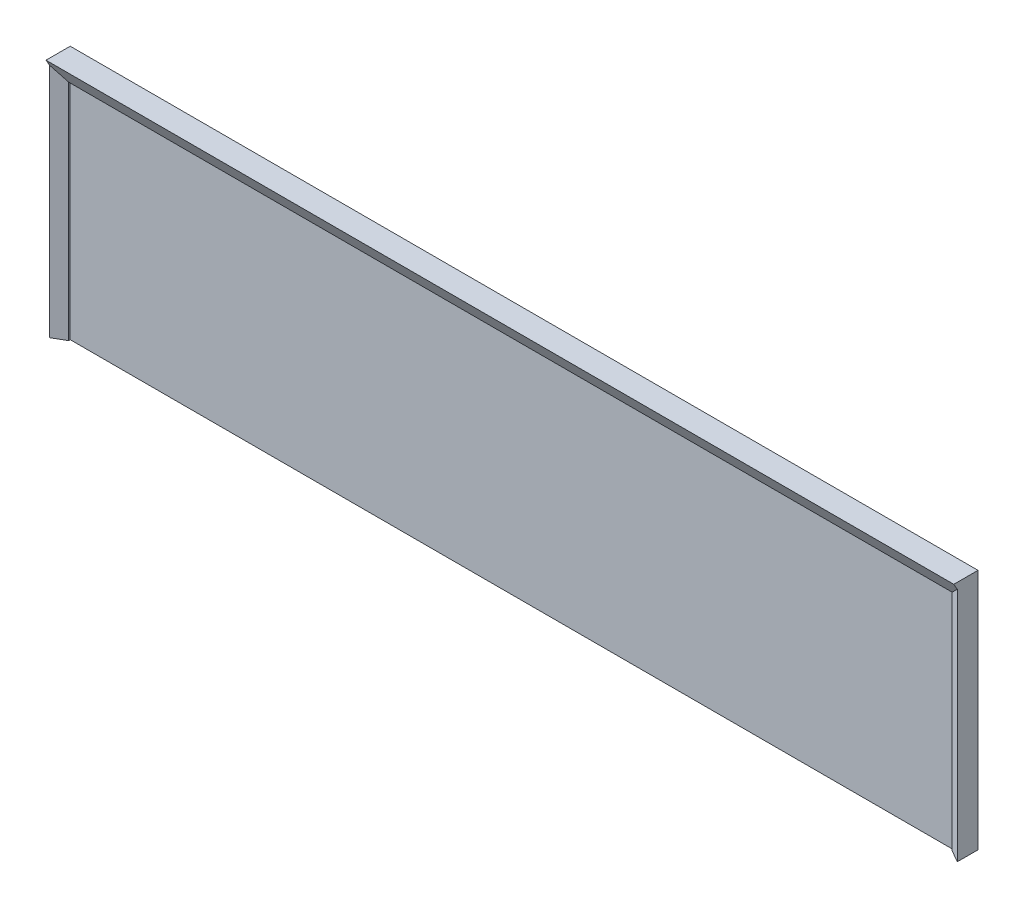
ISO-10303-21;
HEADER;
FILE_DESCRIPTION(('STEP AP214'),'2;1');
FILE_NAME('part.step','',(''),(''),'','','');
FILE_SCHEMA(('AUTOMOTIVE_DESIGN { 1 0 10303 214 1 1 1 1 }'));
ENDSEC;
DATA;
#1=APPLICATION_CONTEXT('core data for automotive mechanical design processes');
#2=APPLICATION_PROTOCOL_DEFINITION('international standard','automotive_design',2000,#1);
#3=PRODUCT_CONTEXT('',#1,'mechanical');
#4=PRODUCT('Part','Part','',(#3));
#5=PRODUCT_RELATED_PRODUCT_CATEGORY('part','',(#4));
#6=PRODUCT_DEFINITION_FORMATION('','',#4);
#7=PRODUCT_DEFINITION_CONTEXT('part definition',#1,'design');
#8=PRODUCT_DEFINITION('design','',#6,#7);
#9=PRODUCT_DEFINITION_SHAPE('','',#8);
#10=(LENGTH_UNIT() NAMED_UNIT(*) SI_UNIT(.MILLI.,.METRE.));
#11=(NAMED_UNIT(*) PLANE_ANGLE_UNIT() SI_UNIT($,.RADIAN.));
#12=(NAMED_UNIT(*) SI_UNIT($,.STERADIAN.) SOLID_ANGLE_UNIT());
#13=UNCERTAINTY_MEASURE_WITH_UNIT(LENGTH_MEASURE(1.E-05),#10,'distance_accuracy_value','');
#14=(GEOMETRIC_REPRESENTATION_CONTEXT(3) GLOBAL_UNCERTAINTY_ASSIGNED_CONTEXT((#13)) GLOBAL_UNIT_ASSIGNED_CONTEXT((#10,
#11,#12)) REPRESENTATION_CONTEXT('',''));
#15=CARTESIAN_POINT('',(0.,0.,0.));
#16=DIRECTION('',(0.,0.,1.));
#17=DIRECTION('',(1.,0.,0.));
#18=AXIS2_PLACEMENT_3D('',#15,#16,#17);
#19=CARTESIAN_POINT('',(0.,0.,2.));
#20=DIRECTION('',(0.,1.,0.));
#21=DIRECTION('',(0.,0.,1.));
#22=AXIS2_PLACEMENT_3D('',#19,#20,#21);
#23=PLANE('',#22);
#24=DIRECTION('',(0.,0.,-1.));
#25=VECTOR('',#24,1.);
#26=CARTESIAN_POINT('',(150.,0.,4.));
#27=LINE('',#26,#25);
#28=CARTESIAN_POINT('',(150.,0.,3.42264973081036));
#29=VERTEX_POINT('',#28);
#30=CARTESIAN_POINT('',(150.,0.,0.));
#31=VERTEX_POINT('',#30);
#32=EDGE_CURVE('E124',#29,#31,#27,.T.);
#33=ORIENTED_EDGE('',*,*,#32,.F.);
#34=DIRECTION('',(-0.86602540378444,0.,-0.499999999999998));
#35=VECTOR('',#34,1.);
#36=CARTESIAN_POINT('',(151.,0.,4.));
#37=LINE('',#36,#35);
#38=CARTESIAN_POINT('',(148.,0.,2.26794919243111));
#39=VERTEX_POINT('',#38);
#40=EDGE_CURVE('E152',#29,#39,#37,.T.);
#41=ORIENTED_EDGE('',*,*,#40,.T.);
#42=DIRECTION('',(0.,0.,-1.));
#43=VECTOR('',#42,1.);
#44=CARTESIAN_POINT('',(148.,0.,4.));
#45=LINE('',#44,#43);
#46=CARTESIAN_POINT('',(148.,0.,2.));
#47=VERTEX_POINT('',#46);
#48=EDGE_CURVE('E174',#39,#47,#45,.T.);
#49=ORIENTED_EDGE('',*,*,#48,.T.);
#50=DIRECTION('',(1.,0.,0.));
#51=VECTOR('',#50,1.);
#52=CARTESIAN_POINT('',(0.,0.,2.));
#53=LINE('',#52,#51);
#54=CARTESIAN_POINT('',(2.,0.,2.));
#55=VERTEX_POINT('',#54);
#56=EDGE_CURVE('E146',#55,#47,#53,.T.);
#57=ORIENTED_EDGE('',*,*,#56,.F.);
#58=DIRECTION('',(0.,0.,-1.));
#59=VECTOR('',#58,1.);
#60=CARTESIAN_POINT('',(2.,0.,4.));
#61=LINE('',#60,#59);
#62=CARTESIAN_POINT('',(2.,0.,2.26794919243111));
#63=VERTEX_POINT('',#62);
#64=EDGE_CURVE('E133',#63,#55,#61,.T.);
#65=ORIENTED_EDGE('',*,*,#64,.F.);
#66=DIRECTION('',(0.86602540378444,0.,-0.499999999999998));
#67=VECTOR('',#66,1.);
#68=CARTESIAN_POINT('',(2.,0.,2.26794919243111));
#69=LINE('',#68,#67);
#70=CARTESIAN_POINT('',(0.,0.,3.42264973081036));
#71=VERTEX_POINT('',#70);
#72=EDGE_CURVE('E143',#63,#71,#69,.F.);
#73=ORIENTED_EDGE('',*,*,#72,.T.);
#74=DIRECTION('',(0.,0.,-1.));
#75=VECTOR('',#74,1.);
#76=CARTESIAN_POINT('',(0.,0.,4.));
#77=LINE('',#76,#75);
#78=CARTESIAN_POINT('',(0.,0.,0.));
#79=VERTEX_POINT('',#78);
#80=EDGE_CURVE('E170',#71,#79,#77,.T.);
#81=ORIENTED_EDGE('',*,*,#80,.T.);
#82=DIRECTION('',(1.,0.,0.));
#83=VECTOR('',#82,1.);
#84=CARTESIAN_POINT('',(0.,0.,0.));
#85=LINE('',#84,#83);
#86=EDGE_CURVE('E149',#79,#31,#85,.T.);
#87=ORIENTED_EDGE('',*,*,#86,.T.);
#88=EDGE_LOOP('',(#33,#41,#49,#57,#65,#73,#81,#87));
#89=FACE_BOUND('',#88,.T.);
#90=ADVANCED_FACE('F41',(#89),#23,.F.);
#91=CARTESIAN_POINT('',(0.,0.,2.));
#92=DIRECTION('',(0.,0.,1.));
#93=DIRECTION('',(1.,0.,0.));
#94=AXIS2_PLACEMENT_3D('',#91,#92,#93);
#95=PLANE('',#94);
#96=DIRECTION('',(1.,0.,0.));
#97=VECTOR('',#96,1.);
#98=CARTESIAN_POINT('',(0.,37.,2.));
#99=LINE('',#98,#97);
#100=CARTESIAN_POINT('',(2.,37.,2.));
#101=VERTEX_POINT('',#100);
#102=CARTESIAN_POINT('',(148.,37.,2.));
#103=VERTEX_POINT('',#102);
#104=EDGE_CURVE('E180',#101,#103,#99,.T.);
#105=ORIENTED_EDGE('',*,*,#104,.F.);
#106=DIRECTION('',(0.,-1.,0.));
#107=VECTOR('',#106,1.);
#108=CARTESIAN_POINT('',(2.,0.,2.));
#109=LINE('',#108,#107);
#110=EDGE_CURVE('E183',#101,#55,#109,.T.);
#111=ORIENTED_EDGE('',*,*,#110,.T.);
#112=ORIENTED_EDGE('',*,*,#56,.T.);
#113=DIRECTION('',(0.,-1.,0.));
#114=VECTOR('',#113,1.);
#115=CARTESIAN_POINT('',(148.,0.,2.));
#116=LINE('',#115,#114);
#117=EDGE_CURVE('E141',#103,#47,#116,.T.);
#118=ORIENTED_EDGE('',*,*,#117,.F.);
#119=EDGE_LOOP('',(#105,#111,#112,#118));
#120=FACE_BOUND('',#119,.T.);
#121=ADVANCED_FACE('F191',(#120),#95,.T.);
#122=CARTESIAN_POINT('',(0.,0.,0.));
#123=DIRECTION('',(0.,0.,1.));
#124=DIRECTION('',(1.,0.,0.));
#125=AXIS2_PLACEMENT_3D('',#122,#123,#124);
#126=PLANE('',#125);
#127=ORIENTED_EDGE('',*,*,#86,.F.);
#128=DIRECTION('',(0.,1.,0.));
#129=VECTOR('',#128,1.);
#130=CARTESIAN_POINT('',(0.,0.,0.));
#131=LINE('',#130,#129);
#132=CARTESIAN_POINT('',(0.,40.,0.));
#133=VERTEX_POINT('',#132);
#134=EDGE_CURVE('E134',#79,#133,#131,.T.);
#135=ORIENTED_EDGE('',*,*,#134,.T.);
#136=DIRECTION('',(1.,0.,0.));
#137=VECTOR('',#136,1.);
#138=CARTESIAN_POINT('',(0.,40.,0.));
#139=LINE('',#138,#137);
#140=CARTESIAN_POINT('',(150.,40.,0.));
#141=VERTEX_POINT('',#140);
#142=EDGE_CURVE('E163',#133,#141,#139,.T.);
#143=ORIENTED_EDGE('',*,*,#142,.T.);
#144=DIRECTION('',(0.,1.,0.));
#145=VECTOR('',#144,1.);
#146=CARTESIAN_POINT('',(150.,0.,0.));
#147=LINE('',#146,#145);
#148=EDGE_CURVE('E120',#31,#141,#147,.T.);
#149=ORIENTED_EDGE('',*,*,#148,.F.);
#150=EDGE_LOOP('',(#127,#135,#143,#149));
#151=FACE_BOUND('',#150,.T.);
#152=ADVANCED_FACE('F211',(#151),#126,.F.);
#153=CARTESIAN_POINT('',(2.,0.,4.));
#154=DIRECTION('',(1.,0.,0.));
#155=DIRECTION('',(0.,1.,0.));
#156=AXIS2_PLACEMENT_3D('',#153,#154,#155);
#157=PLANE('',#156);
#158=DIRECTION('',(0.,0.,-1.));
#159=VECTOR('',#158,1.);
#160=CARTESIAN_POINT('',(2.,37.,4.));
#161=LINE('',#160,#159);
#162=CARTESIAN_POINT('',(2.,37.,2.26794919243111));
#163=VERTEX_POINT('',#162);
#164=EDGE_CURVE('E178',#163,#101,#161,.T.);
#165=ORIENTED_EDGE('',*,*,#164,.F.);
#166=DIRECTION('',(0.,-1.,0.));
#167=VECTOR('',#166,1.);
#168=CARTESIAN_POINT('',(2.,0.,2.26794919243111));
#169=LINE('',#168,#167);
#170=EDGE_CURVE('E157',#163,#63,#169,.T.);
#171=ORIENTED_EDGE('',*,*,#170,.T.);
#172=ORIENTED_EDGE('',*,*,#64,.T.);
#173=ORIENTED_EDGE('',*,*,#110,.F.);
#174=EDGE_LOOP('',(#165,#171,#172,#173));
#175=FACE_BOUND('',#174,.T.);
#176=ADVANCED_FACE('F204',(#175),#157,.T.);
#177=CARTESIAN_POINT('',(0.,37.,4.));
#178=DIRECTION('',(0.,1.,0.));
#179=DIRECTION('',(0.,0.,1.));
#180=AXIS2_PLACEMENT_3D('',#177,#178,#179);
#181=PLANE('',#180);
#182=DIRECTION('',(0.,0.,-1.));
#183=VECTOR('',#182,1.);
#184=CARTESIAN_POINT('',(148.,37.,4.));
#185=LINE('',#184,#183);
#186=CARTESIAN_POINT('',(148.,37.,2.26794919243111));
#187=VERTEX_POINT('',#186);
#188=EDGE_CURVE('E176',#187,#103,#185,.T.);
#189=ORIENTED_EDGE('',*,*,#188,.F.);
#190=DIRECTION('',(-1.,0.,0.));
#191=VECTOR('',#190,1.);
#192=CARTESIAN_POINT('',(2.,37.,2.26794919243111));
#193=LINE('',#192,#191);
#194=EDGE_CURVE('E11',#187,#163,#193,.T.);
#195=ORIENTED_EDGE('',*,*,#194,.T.);
#196=ORIENTED_EDGE('',*,*,#164,.T.);
#197=ORIENTED_EDGE('',*,*,#104,.T.);
#198=EDGE_LOOP('',(#189,#195,#196,#197));
#199=FACE_BOUND('',#198,.T.);
#200=ADVANCED_FACE('F201',(#199),#181,.F.);
#201=CARTESIAN_POINT('',(148.,0.,4.));
#202=DIRECTION('',(1.,0.,0.));
#203=DIRECTION('',(0.,0.,-1.));
#204=AXIS2_PLACEMENT_3D('',#201,#202,#203);
#205=PLANE('',#204);
#206=ORIENTED_EDGE('',*,*,#48,.F.);
#207=DIRECTION('',(0.,1.,0.));
#208=VECTOR('',#207,1.);
#209=CARTESIAN_POINT('',(148.,37.,2.26794919243111));
#210=LINE('',#209,#208);
#211=EDGE_CURVE('E154',#39,#187,#210,.T.);
#212=ORIENTED_EDGE('',*,*,#211,.T.);
#213=ORIENTED_EDGE('',*,*,#188,.T.);
#214=ORIENTED_EDGE('',*,*,#117,.T.);
#215=EDGE_LOOP('',(#206,#212,#213,#214));
#216=FACE_BOUND('',#215,.T.);
#217=ADVANCED_FACE('F200',(#216),#205,.F.);
#218=CARTESIAN_POINT('',(150.,0.,4.));
#219=DIRECTION('',(-1.,0.,0.));
#220=DIRECTION('',(0.,0.,1.));
#221=AXIS2_PLACEMENT_3D('',#218,#219,#220);
#222=PLANE('',#221);
#223=DIRECTION('',(0.,-0.86602540378444,-0.499999999999998));
#224=VECTOR('',#223,1.);
#225=CARTESIAN_POINT('',(150.,40.,4.));
#226=LINE('',#225,#224);
#227=CARTESIAN_POINT('',(150.,40.,4.));
#228=VERTEX_POINT('',#227);
#229=CARTESIAN_POINT('',(150.,39.,3.42264973081036));
#230=VERTEX_POINT('',#229);
#231=EDGE_CURVE('E117',#228,#230,#226,.T.);
#232=ORIENTED_EDGE('',*,*,#231,.T.);
#233=DIRECTION('',(0.,-1.,0.));
#234=VECTOR('',#233,1.);
#235=CARTESIAN_POINT('',(150.,0.,3.42264973081036));
#236=LINE('',#235,#234);
#237=EDGE_CURVE('E140',#230,#29,#236,.T.);
#238=ORIENTED_EDGE('',*,*,#237,.T.);
#239=ORIENTED_EDGE('',*,*,#32,.T.);
#240=ORIENTED_EDGE('',*,*,#148,.T.);
#241=DIRECTION('',(0.,0.,-1.));
#242=VECTOR('',#241,1.);
#243=CARTESIAN_POINT('',(150.,40.,4.));
#244=LINE('',#243,#242);
#245=EDGE_CURVE('E113',#228,#141,#244,.T.);
#246=ORIENTED_EDGE('',*,*,#245,.F.);
#247=EDGE_LOOP('',(#232,#238,#239,#240,#246));
#248=FACE_BOUND('',#247,.T.);
#249=ADVANCED_FACE('F115',(#248),#222,.F.);
#250=CARTESIAN_POINT('',(0.,40.,4.));
#251=DIRECTION('',(0.,1.,0.));
#252=DIRECTION('',(0.,0.,1.));
#253=AXIS2_PLACEMENT_3D('',#250,#251,#252);
#254=PLANE('',#253);
#255=ORIENTED_EDGE('',*,*,#142,.F.);
#256=DIRECTION('',(0.,0.,-1.));
#257=VECTOR('',#256,1.);
#258=CARTESIAN_POINT('',(0.,40.,4.));
#259=LINE('',#258,#257);
#260=CARTESIAN_POINT('',(0.,40.,4.));
#261=VERTEX_POINT('',#260);
#262=EDGE_CURVE('E125',#261,#133,#259,.T.);
#263=ORIENTED_EDGE('',*,*,#262,.F.);
#264=DIRECTION('',(1.,0.,0.));
#265=VECTOR('',#264,1.);
#266=CARTESIAN_POINT('',(0.,40.,4.));
#267=LINE('',#266,#265);
#268=EDGE_CURVE('E129',#261,#228,#267,.T.);
#269=ORIENTED_EDGE('',*,*,#268,.T.);
#270=ORIENTED_EDGE('',*,*,#245,.T.);
#271=EDGE_LOOP('',(#255,#263,#269,#270));
#272=FACE_BOUND('',#271,.T.);
#273=ADVANCED_FACE('F130',(#272),#254,.T.);
#274=CARTESIAN_POINT('',(0.,0.,4.));
#275=DIRECTION('',(-1.,0.,0.));
#276=DIRECTION('',(0.,0.,1.));
#277=AXIS2_PLACEMENT_3D('',#274,#275,#276);
#278=PLANE('',#277);
#279=ORIENTED_EDGE('',*,*,#80,.F.);
#280=DIRECTION('',(0.,-1.,0.));
#281=VECTOR('',#280,1.);
#282=CARTESIAN_POINT('',(0.,0.,3.42264973081036));
#283=LINE('',#282,#281);
#284=CARTESIAN_POINT('',(0.,39.,3.42264973081036));
#285=VERTEX_POINT('',#284);
#286=EDGE_CURVE('E51',#71,#285,#283,.F.);
#287=ORIENTED_EDGE('',*,*,#286,.T.);
#288=DIRECTION('',(0.,0.86602540378444,0.499999999999998));
#289=VECTOR('',#288,1.);
#290=CARTESIAN_POINT('',(0.,9.99999999999993,-13.3205080756887));
#291=LINE('',#290,#289);
#292=EDGE_CURVE('E159',#285,#261,#291,.T.);
#293=ORIENTED_EDGE('',*,*,#292,.T.);
#294=ORIENTED_EDGE('',*,*,#262,.T.);
#295=ORIENTED_EDGE('',*,*,#134,.F.);
#296=EDGE_LOOP('',(#279,#287,#293,#294,#295));
#297=FACE_BOUND('',#296,.T.);
#298=ADVANCED_FACE('F209',(#297),#278,.T.);
#299=CARTESIAN_POINT('',(2.,0.,2.26794919243111));
#300=DIRECTION('',(-0.499999999999998,0.,-0.86602540378444));
#301=DIRECTION('',(0.,-1.,0.));
#302=AXIS2_PLACEMENT_3D('',#299,#300,#301);
#303=PLANE('',#302);
#304=ORIENTED_EDGE('',*,*,#72,.F.);
#305=ORIENTED_EDGE('',*,*,#170,.F.);
#306=DIRECTION('',(0.654653670707978,-0.654653670707978,-0.377964473009225));
#307=VECTOR('',#306,1.);
#308=CARTESIAN_POINT('',(-0.571428571428588,39.5714285714286,3.7525641703473));
#309=LINE('',#308,#307);
#310=EDGE_CURVE('E46',#285,#163,#309,.T.);
#311=ORIENTED_EDGE('',*,*,#310,.F.);
#312=ORIENTED_EDGE('',*,*,#286,.F.);
#313=EDGE_LOOP('',(#304,#305,#311,#312));
#314=FACE_BOUND('',#313,.T.);
#315=ADVANCED_FACE('F44',(#314),#303,.F.);
#316=CARTESIAN_POINT('',(0.,40.,4.));
#317=DIRECTION('',(0.,-0.499999999999998,0.86602540378444));
#318=DIRECTION('',(-1.,0.,0.));
#319=AXIS2_PLACEMENT_3D('',#316,#317,#318);
#320=PLANE('',#319);
#321=ORIENTED_EDGE('',*,*,#310,.T.);
#322=ORIENTED_EDGE('',*,*,#194,.F.);
#323=DIRECTION('',(-0.654653670707978,-0.654653670707978,-0.377964473009225));
#324=VECTOR('',#323,1.);
#325=CARTESIAN_POINT('',(86.2857142857142,-24.7142857142858,-33.3628102775571));
#326=LINE('',#325,#324);
#327=EDGE_CURVE('E138',#230,#187,#326,.T.);
#328=ORIENTED_EDGE('',*,*,#327,.F.);
#329=ORIENTED_EDGE('',*,*,#231,.F.);
#330=ORIENTED_EDGE('',*,*,#268,.F.);
#331=ORIENTED_EDGE('',*,*,#292,.F.);
#332=EDGE_LOOP('',(#321,#322,#328,#329,#330,#331));
#333=FACE_BOUND('',#332,.T.);
#334=ADVANCED_FACE('F137',(#333),#320,.T.);
#335=CARTESIAN_POINT('',(151.,0.,4.));
#336=DIRECTION('',(-0.499999999999998,0.,0.86602540378444));
#337=DIRECTION('',(0.,1.,0.));
#338=AXIS2_PLACEMENT_3D('',#335,#336,#337);
#339=PLANE('',#338);
#340=ORIENTED_EDGE('',*,*,#327,.T.);
#341=ORIENTED_EDGE('',*,*,#211,.F.);
#342=ORIENTED_EDGE('',*,*,#40,.F.);
#343=ORIENTED_EDGE('',*,*,#237,.F.);
#344=EDGE_LOOP('',(#340,#341,#342,#343));
#345=FACE_BOUND('',#344,.T.);
#346=ADVANCED_FACE('F212',(#345),#339,.T.);
#347=CLOSED_SHELL('',(#90,#121,#152,#176,#200,#217,#249,#273,#298,#315,#334,#346));
#348=MANIFOLD_SOLID_BREP('B2',#347);
#349=ADVANCED_BREP_SHAPE_REPRESENTATION('',(#18,#348),#14);
#350=SHAPE_DEFINITION_REPRESENTATION(#9,#349);
ENDSEC;
END-ISO-10303-21;
